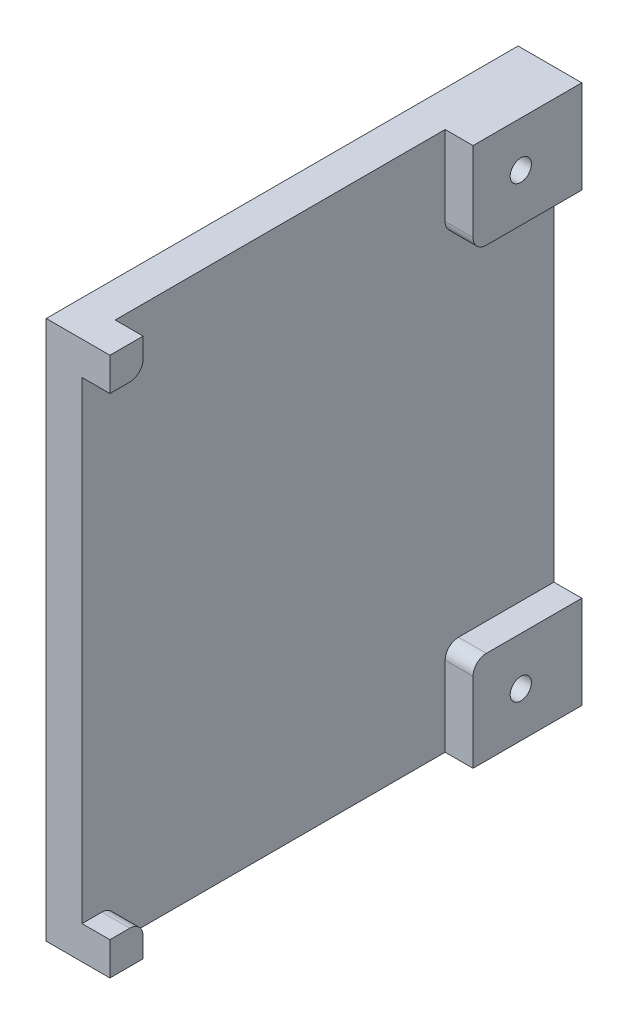
ISO-10303-21;
HEADER;
FILE_DESCRIPTION(('STEP AP214'),'2;1');
FILE_NAME('part.step','',(''),(''),'','','');
FILE_SCHEMA(('AUTOMOTIVE_DESIGN { 1 0 10303 214 1 1 1 1 }'));
ENDSEC;
DATA;
#1=APPLICATION_CONTEXT('core data for automotive mechanical design processes');
#2=APPLICATION_PROTOCOL_DEFINITION('international standard','automotive_design',2000,#1);
#3=PRODUCT_CONTEXT('',#1,'mechanical');
#4=PRODUCT('Part','Part','',(#3));
#5=PRODUCT_RELATED_PRODUCT_CATEGORY('part','',(#4));
#6=PRODUCT_DEFINITION_FORMATION('','',#4);
#7=PRODUCT_DEFINITION_CONTEXT('part definition',#1,'design');
#8=PRODUCT_DEFINITION('design','',#6,#7);
#9=PRODUCT_DEFINITION_SHAPE('','',#8);
#10=(LENGTH_UNIT() NAMED_UNIT(*) SI_UNIT(.MILLI.,.METRE.));
#11=(NAMED_UNIT(*) PLANE_ANGLE_UNIT() SI_UNIT($,.RADIAN.));
#12=(NAMED_UNIT(*) SI_UNIT($,.STERADIAN.) SOLID_ANGLE_UNIT());
#13=UNCERTAINTY_MEASURE_WITH_UNIT(LENGTH_MEASURE(1.E-05),#10,'distance_accuracy_value','');
#14=(GEOMETRIC_REPRESENTATION_CONTEXT(3) GLOBAL_UNCERTAINTY_ASSIGNED_CONTEXT((#13)) GLOBAL_UNIT_ASSIGNED_CONTEXT((#10,
#11,#12)) REPRESENTATION_CONTEXT('',''));
#15=CARTESIAN_POINT('',(0.,0.,0.));
#16=DIRECTION('',(0.,0.,1.));
#17=DIRECTION('',(1.,0.,0.));
#18=AXIS2_PLACEMENT_3D('',#15,#16,#17);
#19=CARTESIAN_POINT('',(3.,0.,0.));
#20=DIRECTION('',(1.,0.,0.));
#21=DIRECTION('',(0.,0.,-1.));
#22=AXIS2_PLACEMENT_3D('',#19,#20,#21);
#23=PLANE('',#22);
#24=DIRECTION('',(0.,1.,0.));
#25=VECTOR('',#24,1.);
#26=CARTESIAN_POINT('',(3.,0.,17.78));
#27=LINE('',#26,#25);
#28=CARTESIAN_POINT('',(3.,-17.82,17.78));
#29=VERTEX_POINT('',#28);
#30=CARTESIAN_POINT('',(3.,17.82,17.78));
#31=VERTEX_POINT('',#30);
#32=EDGE_CURVE('E297',#29,#31,#27,.T.);
#33=ORIENTED_EDGE('',*,*,#32,.F.);
#34=DIRECTION('',(0.,0.,-1.));
#35=VECTOR('',#34,1.);
#36=CARTESIAN_POINT('',(3.,-17.82,0.));
#37=LINE('',#36,#35);
#38=CARTESIAN_POINT('',(3.,-17.82,16.28));
#39=VERTEX_POINT('',#38);
#40=EDGE_CURVE('E269',#29,#39,#37,.T.);
#41=ORIENTED_EDGE('',*,*,#40,.T.);
#42=CARTESIAN_POINT('',(3.,-18.82,16.28));
#43=DIRECTION('',(1.,0.,0.));
#44=DIRECTION('',(0.,0.,-1.));
#45=AXIS2_PLACEMENT_3D('',#42,#43,#44);
#46=CIRCLE('',#45,1.);
#47=CARTESIAN_POINT('',(3.,-18.82,15.28));
#48=VERTEX_POINT('',#47);
#49=EDGE_CURVE('E349',#39,#48,#46,.F.);
#50=ORIENTED_EDGE('',*,*,#49,.T.);
#51=DIRECTION('',(0.,1.,0.));
#52=VECTOR('',#51,1.);
#53=CARTESIAN_POINT('',(3.,0.,15.28));
#54=LINE('',#53,#52);
#55=CARTESIAN_POINT('',(3.,-20.32,15.28));
#56=VERTEX_POINT('',#55);
#57=EDGE_CURVE('E256',#56,#48,#54,.T.);
#58=ORIENTED_EDGE('',*,*,#57,.F.);
#59=DIRECTION('',(0.,0.,-1.));
#60=VECTOR('',#59,1.);
#61=CARTESIAN_POINT('',(3.,-20.32,0.));
#62=LINE('',#61,#60);
#63=CARTESIAN_POINT('',(3.,-20.32,-9.5826));
#64=VERTEX_POINT('',#63);
#65=EDGE_CURVE('E303',#56,#64,#62,.T.);
#66=ORIENTED_EDGE('',*,*,#65,.T.);
#67=DIRECTION('',(0.,1.,0.));
#68=VECTOR('',#67,1.);
#69=CARTESIAN_POINT('',(3.,0.,-9.5826));
#70=LINE('',#69,#68);
#71=CARTESIAN_POINT('',(3.,-14.3164,-9.5826));
#72=VERTEX_POINT('',#71);
#73=EDGE_CURVE('E228',#64,#72,#70,.T.);
#74=ORIENTED_EDGE('',*,*,#73,.T.);
#75=CARTESIAN_POINT('',(3.,-14.3164,-10.5826));
#76=DIRECTION('',(1.,0.,0.));
#77=DIRECTION('',(0.,0.,-1.));
#78=AXIS2_PLACEMENT_3D('',#75,#76,#77);
#79=CIRCLE('',#78,1.);
#80=CARTESIAN_POINT('',(3.,-13.3164,-10.5826));
#81=VERTEX_POINT('',#80);
#82=EDGE_CURVE('E342',#72,#81,#79,.F.);
#83=ORIENTED_EDGE('',*,*,#82,.T.);
#84=DIRECTION('',(0.,0.,1.));
#85=VECTOR('',#84,1.);
#86=CARTESIAN_POINT('',(3.,-13.3164,0.));
#87=LINE('',#86,#85);
#88=CARTESIAN_POINT('',(3.,-13.3164,-17.78));
#89=VERTEX_POINT('',#88);
#90=EDGE_CURVE('E225',#89,#81,#87,.T.);
#91=ORIENTED_EDGE('',*,*,#90,.F.);
#92=DIRECTION('',(0.,1.,0.));
#93=VECTOR('',#92,1.);
#94=CARTESIAN_POINT('',(3.,0.,-17.78));
#95=LINE('',#94,#93);
#96=CARTESIAN_POINT('',(3.,13.3164,-17.78));
#97=VERTEX_POINT('',#96);
#98=EDGE_CURVE('E304',#89,#97,#95,.T.);
#99=ORIENTED_EDGE('',*,*,#98,.T.);
#100=DIRECTION('',(0.,0.,1.));
#101=VECTOR('',#100,1.);
#102=CARTESIAN_POINT('',(3.,13.3164,0.));
#103=LINE('',#102,#101);
#104=CARTESIAN_POINT('',(3.,13.3164,-10.5826));
#105=VERTEX_POINT('',#104);
#106=EDGE_CURVE('E217',#97,#105,#103,.T.);
#107=ORIENTED_EDGE('',*,*,#106,.T.);
#108=CARTESIAN_POINT('',(3.,14.3164,-10.5826));
#109=DIRECTION('',(1.,0.,0.));
#110=DIRECTION('',(0.,0.,-1.));
#111=AXIS2_PLACEMENT_3D('',#108,#109,#110);
#112=CIRCLE('',#111,1.);
#113=CARTESIAN_POINT('',(3.,14.3164,-9.5826));
#114=VERTEX_POINT('',#113);
#115=EDGE_CURVE('E341',#105,#114,#112,.F.);
#116=ORIENTED_EDGE('',*,*,#115,.T.);
#117=DIRECTION('',(0.,-1.,0.));
#118=VECTOR('',#117,1.);
#119=CARTESIAN_POINT('',(3.,0.,-9.5826));
#120=LINE('',#119,#118);
#121=CARTESIAN_POINT('',(3.,20.32,-9.5826));
#122=VERTEX_POINT('',#121);
#123=EDGE_CURVE('E253',#122,#114,#120,.T.);
#124=ORIENTED_EDGE('',*,*,#123,.F.);
#125=DIRECTION('',(0.,0.,-1.));
#126=VECTOR('',#125,1.);
#127=CARTESIAN_POINT('',(3.,20.32,0.));
#128=LINE('',#127,#126);
#129=CARTESIAN_POINT('',(3.,20.32,15.28));
#130=VERTEX_POINT('',#129);
#131=EDGE_CURVE('E222',#130,#122,#128,.T.);
#132=ORIENTED_EDGE('',*,*,#131,.F.);
#133=DIRECTION('',(0.,-1.,0.));
#134=VECTOR('',#133,1.);
#135=CARTESIAN_POINT('',(3.,0.,15.28));
#136=LINE('',#135,#134);
#137=CARTESIAN_POINT('',(3.,18.82,15.28));
#138=VERTEX_POINT('',#137);
#139=EDGE_CURVE('E244',#130,#138,#136,.T.);
#140=ORIENTED_EDGE('',*,*,#139,.T.);
#141=CARTESIAN_POINT('',(3.,18.82,16.28));
#142=DIRECTION('',(1.,0.,0.));
#143=DIRECTION('',(0.,0.,-1.));
#144=AXIS2_PLACEMENT_3D('',#141,#142,#143);
#145=CIRCLE('',#144,1.);
#146=CARTESIAN_POINT('',(3.,17.82,16.28));
#147=VERTEX_POINT('',#146);
#148=EDGE_CURVE('E350',#138,#147,#145,.F.);
#149=ORIENTED_EDGE('',*,*,#148,.T.);
#150=DIRECTION('',(0.,0.,-1.));
#151=VECTOR('',#150,1.);
#152=CARTESIAN_POINT('',(3.,17.82,0.));
#153=LINE('',#152,#151);
#154=EDGE_CURVE('E236',#31,#147,#153,.T.);
#155=ORIENTED_EDGE('',*,*,#154,.F.);
#156=EDGE_LOOP('',(#33,#41,#50,#58,#66,#74,#83,#91,#99,#107,#116,#124,#132,#140,#149,#155));
#157=FACE_BOUND('',#156,.T.);
#158=ADVANCED_FACE('F43',(#157),#23,.T.);
#159=CARTESIAN_POINT('',(3.,20.32,0.));
#160=DIRECTION('',(0.,1.,0.));
#161=DIRECTION('',(0.,0.,1.));
#162=AXIS2_PLACEMENT_3D('',#159,#160,#161);
#163=PLANE('',#162);
#164=DIRECTION('',(-1.,0.,0.));
#165=VECTOR('',#164,1.);
#166=CARTESIAN_POINT('',(3.,20.32,-17.78));
#167=LINE('',#166,#165);
#168=CARTESIAN_POINT('',(5.1,20.32,-17.78));
#169=VERTEX_POINT('',#168);
#170=CARTESIAN_POINT('',(0.300000000000002,20.32,-17.78));
#171=VERTEX_POINT('',#170);
#172=EDGE_CURVE('E310',#169,#171,#167,.T.);
#173=ORIENTED_EDGE('',*,*,#172,.T.);
#174=DIRECTION('',(0.,0.,1.));
#175=VECTOR('',#174,1.);
#176=CARTESIAN_POINT('',(0.300000000000002,20.32,17.78));
#177=LINE('',#176,#175);
#178=CARTESIAN_POINT('',(0.300000000000002,20.32,17.78));
#179=VERTEX_POINT('',#178);
#180=EDGE_CURVE('E371',#171,#179,#177,.T.);
#181=ORIENTED_EDGE('',*,*,#180,.T.);
#182=DIRECTION('',(-1.,0.,0.));
#183=VECTOR('',#182,1.);
#184=CARTESIAN_POINT('',(3.,20.32,17.78));
#185=LINE('',#184,#183);
#186=CARTESIAN_POINT('',(5.1,20.32,17.78));
#187=VERTEX_POINT('',#186);
#188=EDGE_CURVE('E312',#187,#179,#185,.T.);
#189=ORIENTED_EDGE('',*,*,#188,.F.);
#190=DIRECTION('',(0.,0.,1.));
#191=VECTOR('',#190,1.);
#192=CARTESIAN_POINT('',(5.1,20.32,0.));
#193=LINE('',#192,#191);
#194=CARTESIAN_POINT('',(5.1,20.32,15.28));
#195=VERTEX_POINT('',#194);
#196=EDGE_CURVE('E232',#195,#187,#193,.T.);
#197=ORIENTED_EDGE('',*,*,#196,.F.);
#198=DIRECTION('',(-1.,0.,0.));
#199=VECTOR('',#198,1.);
#200=CARTESIAN_POINT('',(5.1,20.32,15.28));
#201=LINE('',#200,#199);
#202=EDGE_CURVE('E254',#195,#130,#201,.T.);
#203=ORIENTED_EDGE('',*,*,#202,.T.);
#204=ORIENTED_EDGE('',*,*,#131,.T.);
#205=DIRECTION('',(-1.,0.,0.));
#206=VECTOR('',#205,1.);
#207=CARTESIAN_POINT('',(5.1,20.32,-9.5826));
#208=LINE('',#207,#206);
#209=CARTESIAN_POINT('',(5.1,20.32,-9.5826));
#210=VERTEX_POINT('',#209);
#211=EDGE_CURVE('E202',#210,#122,#208,.T.);
#212=ORIENTED_EDGE('',*,*,#211,.F.);
#213=DIRECTION('',(0.,0.,1.));
#214=VECTOR('',#213,1.);
#215=CARTESIAN_POINT('',(5.1,20.32,0.));
#216=LINE('',#215,#214);
#217=EDGE_CURVE('E210',#169,#210,#216,.T.);
#218=ORIENTED_EDGE('',*,*,#217,.F.);
#219=EDGE_LOOP('',(#173,#181,#189,#197,#203,#204,#212,#218));
#220=FACE_BOUND('',#219,.T.);
#221=ADVANCED_FACE('F219',(#220),#163,.T.);
#222=CARTESIAN_POINT('',(3.,0.,17.78));
#223=DIRECTION('',(0.,0.,1.));
#224=DIRECTION('',(1.,0.,0.));
#225=AXIS2_PLACEMENT_3D('',#222,#223,#224);
#226=PLANE('',#225);
#227=ORIENTED_EDGE('',*,*,#188,.T.);
#228=DIRECTION('',(0.,-1.,0.));
#229=VECTOR('',#228,1.);
#230=CARTESIAN_POINT('',(0.300000000000002,-20.32,17.78));
#231=LINE('',#230,#229);
#232=CARTESIAN_POINT('',(0.300000000000002,-20.32,17.78));
#233=VERTEX_POINT('',#232);
#234=EDGE_CURVE('E366',#179,#233,#231,.T.);
#235=ORIENTED_EDGE('',*,*,#234,.T.);
#236=DIRECTION('',(-1.,0.,0.));
#237=VECTOR('',#236,1.);
#238=CARTESIAN_POINT('',(3.,-20.32,17.78));
#239=LINE('',#238,#237);
#240=CARTESIAN_POINT('',(5.1,-20.32,17.78));
#241=VERTEX_POINT('',#240);
#242=EDGE_CURVE('E311',#241,#233,#239,.T.);
#243=ORIENTED_EDGE('',*,*,#242,.F.);
#244=DIRECTION('',(0.,-1.,0.));
#245=VECTOR('',#244,1.);
#246=CARTESIAN_POINT('',(5.1,0.,17.78));
#247=LINE('',#246,#245);
#248=CARTESIAN_POINT('',(5.1,-17.82,17.78));
#249=VERTEX_POINT('',#248);
#250=EDGE_CURVE('E260',#249,#241,#247,.T.);
#251=ORIENTED_EDGE('',*,*,#250,.F.);
#252=DIRECTION('',(-1.,0.,0.));
#253=VECTOR('',#252,1.);
#254=CARTESIAN_POINT('',(5.1,-17.82,17.78));
#255=LINE('',#254,#253);
#256=EDGE_CURVE('E247',#249,#29,#255,.T.);
#257=ORIENTED_EDGE('',*,*,#256,.T.);
#258=ORIENTED_EDGE('',*,*,#32,.T.);
#259=DIRECTION('',(-1.,0.,0.));
#260=VECTOR('',#259,1.);
#261=CARTESIAN_POINT('',(5.1,17.82,17.78));
#262=LINE('',#261,#260);
#263=CARTESIAN_POINT('',(5.1,17.82,17.78));
#264=VERTEX_POINT('',#263);
#265=EDGE_CURVE('E242',#264,#31,#262,.T.);
#266=ORIENTED_EDGE('',*,*,#265,.F.);
#267=DIRECTION('',(0.,-1.,0.));
#268=VECTOR('',#267,1.);
#269=CARTESIAN_POINT('',(5.1,0.,17.78));
#270=LINE('',#269,#268);
#271=EDGE_CURVE('E237',#187,#264,#270,.T.);
#272=ORIENTED_EDGE('',*,*,#271,.F.);
#273=EDGE_LOOP('',(#227,#235,#243,#251,#257,#258,#266,#272));
#274=FACE_BOUND('',#273,.T.);
#275=ADVANCED_FACE('F426',(#274),#226,.T.);
#276=CARTESIAN_POINT('',(3.,-20.32,0.));
#277=DIRECTION('',(0.,1.,0.));
#278=DIRECTION('',(0.,0.,1.));
#279=AXIS2_PLACEMENT_3D('',#276,#277,#278);
#280=PLANE('',#279);
#281=ORIENTED_EDGE('',*,*,#242,.T.);
#282=DIRECTION('',(0.,0.,-1.));
#283=VECTOR('',#282,1.);
#284=CARTESIAN_POINT('',(0.300000000000002,-20.32,0.));
#285=LINE('',#284,#283);
#286=CARTESIAN_POINT('',(0.300000000000002,-20.32,-17.78));
#287=VERTEX_POINT('',#286);
#288=EDGE_CURVE('E69',#233,#287,#285,.T.);
#289=ORIENTED_EDGE('',*,*,#288,.T.);
#290=DIRECTION('',(-1.,0.,0.));
#291=VECTOR('',#290,1.);
#292=CARTESIAN_POINT('',(3.,-20.32,-17.78));
#293=LINE('',#292,#291);
#294=CARTESIAN_POINT('',(5.1,-20.32,-17.78));
#295=VERTEX_POINT('',#294);
#296=EDGE_CURVE('E307',#295,#287,#293,.T.);
#297=ORIENTED_EDGE('',*,*,#296,.F.);
#298=DIRECTION('',(0.,0.,-1.));
#299=VECTOR('',#298,1.);
#300=CARTESIAN_POINT('',(5.1,-20.32,0.));
#301=LINE('',#300,#299);
#302=CARTESIAN_POINT('',(5.1,-20.32,-9.5826));
#303=VERTEX_POINT('',#302);
#304=EDGE_CURVE('E288',#303,#295,#301,.T.);
#305=ORIENTED_EDGE('',*,*,#304,.F.);
#306=DIRECTION('',(-1.,0.,0.));
#307=VECTOR('',#306,1.);
#308=CARTESIAN_POINT('',(5.1,-20.32,-9.5826));
#309=LINE('',#308,#307);
#310=EDGE_CURVE('E286',#303,#64,#309,.T.);
#311=ORIENTED_EDGE('',*,*,#310,.T.);
#312=ORIENTED_EDGE('',*,*,#65,.F.);
#313=DIRECTION('',(-1.,0.,0.));
#314=VECTOR('',#313,1.);
#315=CARTESIAN_POINT('',(5.1,-20.32,15.28));
#316=LINE('',#315,#314);
#317=CARTESIAN_POINT('',(5.1,-20.32,15.28));
#318=VERTEX_POINT('',#317);
#319=EDGE_CURVE('E268',#318,#56,#316,.T.);
#320=ORIENTED_EDGE('',*,*,#319,.F.);
#321=DIRECTION('',(0.,0.,-1.));
#322=VECTOR('',#321,1.);
#323=CARTESIAN_POINT('',(5.1,-20.32,0.));
#324=LINE('',#323,#322);
#325=EDGE_CURVE('E263',#241,#318,#324,.T.);
#326=ORIENTED_EDGE('',*,*,#325,.F.);
#327=EDGE_LOOP('',(#281,#289,#297,#305,#311,#312,#320,#326));
#328=FACE_BOUND('',#327,.T.);
#329=ADVANCED_FACE('F441',(#328),#280,.F.);
#330=CARTESIAN_POINT('',(3.,0.,-17.78));
#331=DIRECTION('',(0.,0.,1.));
#332=DIRECTION('',(1.,0.,0.));
#333=AXIS2_PLACEMENT_3D('',#330,#331,#332);
#334=PLANE('',#333);
#335=ORIENTED_EDGE('',*,*,#296,.T.);
#336=DIRECTION('',(0.,1.,0.));
#337=VECTOR('',#336,1.);
#338=CARTESIAN_POINT('',(0.300000000000002,0.,-17.78));
#339=LINE('',#338,#337);
#340=EDGE_CURVE('E63',#287,#171,#339,.T.);
#341=ORIENTED_EDGE('',*,*,#340,.T.);
#342=ORIENTED_EDGE('',*,*,#172,.F.);
#343=DIRECTION('',(0.,1.,0.));
#344=VECTOR('',#343,1.);
#345=CARTESIAN_POINT('',(5.1,0.,-17.78));
#346=LINE('',#345,#344);
#347=CARTESIAN_POINT('',(5.1,13.3164,-17.78));
#348=VERTEX_POINT('',#347);
#349=EDGE_CURVE('E215',#348,#169,#346,.T.);
#350=ORIENTED_EDGE('',*,*,#349,.F.);
#351=DIRECTION('',(-1.,0.,0.));
#352=VECTOR('',#351,1.);
#353=CARTESIAN_POINT('',(5.1,13.3164,-17.78));
#354=LINE('',#353,#352);
#355=EDGE_CURVE('E223',#348,#97,#354,.T.);
#356=ORIENTED_EDGE('',*,*,#355,.T.);
#357=ORIENTED_EDGE('',*,*,#98,.F.);
#358=DIRECTION('',(-1.,0.,0.));
#359=VECTOR('',#358,1.);
#360=CARTESIAN_POINT('',(5.1,-13.3164,-17.78));
#361=LINE('',#360,#359);
#362=CARTESIAN_POINT('',(5.1,-13.3164,-17.78));
#363=VERTEX_POINT('',#362);
#364=EDGE_CURVE('E298',#363,#89,#361,.T.);
#365=ORIENTED_EDGE('',*,*,#364,.F.);
#366=DIRECTION('',(0.,1.,0.));
#367=VECTOR('',#366,1.);
#368=CARTESIAN_POINT('',(5.1,0.,-17.78));
#369=LINE('',#368,#367);
#370=EDGE_CURVE('E280',#295,#363,#369,.T.);
#371=ORIENTED_EDGE('',*,*,#370,.F.);
#372=EDGE_LOOP('',(#335,#341,#342,#350,#356,#357,#365,#371));
#373=FACE_BOUND('',#372,.T.);
#374=ADVANCED_FACE('F440',(#373),#334,.F.);
#375=CARTESIAN_POINT('',(0.,0.,0.));
#376=DIRECTION('',(1.,0.,0.));
#377=DIRECTION('',(0.,0.,-1.));
#378=AXIS2_PLACEMENT_3D('',#375,#376,#377);
#379=PLANE('',#378);
#380=DIRECTION('',(0.,0.,1.));
#381=VECTOR('',#380,1.);
#382=CARTESIAN_POINT('',(0.,-20.02,0.));
#383=LINE('',#382,#381);
#384=CARTESIAN_POINT('',(0.,-20.02,-17.48));
#385=VERTEX_POINT('',#384);
#386=CARTESIAN_POINT('',(0.,-20.02,17.48));
#387=VERTEX_POINT('',#386);
#388=EDGE_CURVE('E363',#385,#387,#383,.T.);
#389=ORIENTED_EDGE('',*,*,#388,.T.);
#390=DIRECTION('',(0.,1.,0.));
#391=VECTOR('',#390,1.);
#392=CARTESIAN_POINT('',(0.,20.32,17.48));
#393=LINE('',#392,#391);
#394=CARTESIAN_POINT('',(0.,20.02,17.48));
#395=VERTEX_POINT('',#394);
#396=EDGE_CURVE('E361',#387,#395,#393,.T.);
#397=ORIENTED_EDGE('',*,*,#396,.T.);
#398=DIRECTION('',(0.,0.,-1.));
#399=VECTOR('',#398,1.);
#400=CARTESIAN_POINT('',(0.,20.02,-17.78));
#401=LINE('',#400,#399);
#402=CARTESIAN_POINT('',(0.,20.02,-17.48));
#403=VERTEX_POINT('',#402);
#404=EDGE_CURVE('E357',#395,#403,#401,.T.);
#405=ORIENTED_EDGE('',*,*,#404,.T.);
#406=DIRECTION('',(0.,-1.,0.));
#407=VECTOR('',#406,1.);
#408=CARTESIAN_POINT('',(0.,0.,-17.48));
#409=LINE('',#408,#407);
#410=EDGE_CURVE('E360',#403,#385,#409,.T.);
#411=ORIENTED_EDGE('',*,*,#410,.T.);
#412=EDGE_LOOP('',(#389,#397,#405,#411));
#413=FACE_BOUND('',#412,.T.);
#414=CARTESIAN_POINT('',(0.,16.9164,-13.1826));
#415=DIRECTION('',(1.,0.,0.));
#416=DIRECTION('',(0.,0.,-1.));
#417=AXIS2_PLACEMENT_3D('',#414,#415,#416);
#418=CIRCLE('',#417,1.1);
#419=CARTESIAN_POINT('',(0.,16.9164,-14.2826));
#420=VERTEX_POINT('',#419);
#421=EDGE_CURVE('E354',#420,#420,#418,.T.);
#422=ORIENTED_EDGE('',*,*,#421,.T.);
#423=EDGE_LOOP('',(#422));
#424=FACE_BOUND('',#423,.T.);
#425=CARTESIAN_POINT('',(0.,-16.9164,-13.1826));
#426=DIRECTION('',(1.,0.,0.));
#427=DIRECTION('',(0.,0.,-1.));
#428=AXIS2_PLACEMENT_3D('',#425,#426,#427);
#429=CIRCLE('',#428,1.1);
#430=CARTESIAN_POINT('',(0.,-16.9164,-14.2826));
#431=VERTEX_POINT('',#430);
#432=EDGE_CURVE('E352',#431,#431,#429,.T.);
#433=ORIENTED_EDGE('',*,*,#432,.T.);
#434=EDGE_LOOP('',(#433));
#435=FACE_BOUND('',#434,.T.);
#436=ADVANCED_FACE('F432',(#413,#424,#435),#379,.F.);
#437=CARTESIAN_POINT('',(5.1,-13.3164,0.));
#438=DIRECTION('',(0.,-1.,0.));
#439=DIRECTION('',(0.,0.,-1.));
#440=AXIS2_PLACEMENT_3D('',#437,#438,#439);
#441=PLANE('',#440);
#442=ORIENTED_EDGE('',*,*,#90,.T.);
#443=DIRECTION('',(-1.,0.,0.));
#444=VECTOR('',#443,1.);
#445=CARTESIAN_POINT('',(5.1,-13.3164,-10.5826));
#446=LINE('',#445,#444);
#447=CARTESIAN_POINT('',(5.1,-13.3164,-10.5826));
#448=VERTEX_POINT('',#447);
#449=EDGE_CURVE('E316',#81,#448,#446,.F.);
#450=ORIENTED_EDGE('',*,*,#449,.T.);
#451=DIRECTION('',(0.,0.,1.));
#452=VECTOR('',#451,1.);
#453=CARTESIAN_POINT('',(5.1,-13.3164,0.));
#454=LINE('',#453,#452);
#455=EDGE_CURVE('E285',#363,#448,#454,.T.);
#456=ORIENTED_EDGE('',*,*,#455,.F.);
#457=ORIENTED_EDGE('',*,*,#364,.T.);
#458=EDGE_LOOP('',(#442,#450,#456,#457));
#459=FACE_BOUND('',#458,.T.);
#460=ADVANCED_FACE('F435',(#459),#441,.F.);
#461=CARTESIAN_POINT('',(5.1,0.,-9.5826));
#462=DIRECTION('',(0.,0.,1.));
#463=DIRECTION('',(0.,-1.,0.));
#464=AXIS2_PLACEMENT_3D('',#461,#462,#463);
#465=PLANE('',#464);
#466=DIRECTION('',(0.,1.,0.));
#467=VECTOR('',#466,1.);
#468=CARTESIAN_POINT('',(5.1,0.,-9.5826));
#469=LINE('',#468,#467);
#470=CARTESIAN_POINT('',(5.1,-14.3164,-9.5826));
#471=VERTEX_POINT('',#470);
#472=EDGE_CURVE('E281',#303,#471,#469,.T.);
#473=ORIENTED_EDGE('',*,*,#472,.T.);
#474=DIRECTION('',(-1.,0.,0.));
#475=VECTOR('',#474,1.);
#476=CARTESIAN_POINT('',(3.,-14.3164,-9.5826));
#477=LINE('',#476,#475);
#478=EDGE_CURVE('E317',#471,#72,#477,.T.);
#479=ORIENTED_EDGE('',*,*,#478,.T.);
#480=ORIENTED_EDGE('',*,*,#73,.F.);
#481=ORIENTED_EDGE('',*,*,#310,.F.);
#482=EDGE_LOOP('',(#473,#479,#480,#481));
#483=FACE_BOUND('',#482,.T.);
#484=ADVANCED_FACE('F536',(#483),#465,.T.);
#485=CARTESIAN_POINT('',(5.1,0.,0.));
#486=DIRECTION('',(1.,0.,0.));
#487=DIRECTION('',(0.,0.,-1.));
#488=AXIS2_PLACEMENT_3D('',#485,#486,#487);
#489=PLANE('',#488);
#490=CARTESIAN_POINT('',(5.1,-16.9164,-13.1826));
#491=DIRECTION('',(1.,0.,0.));
#492=DIRECTION('',(0.,0.,-1.));
#493=AXIS2_PLACEMENT_3D('',#490,#491,#492);
#494=CIRCLE('',#493,0.799999999999999);
#495=CARTESIAN_POINT('',(5.1,-16.9164,-13.9826));
#496=VERTEX_POINT('',#495);
#497=EDGE_CURVE('E275',#496,#496,#494,.T.);
#498=ORIENTED_EDGE('',*,*,#497,.F.);
#499=EDGE_LOOP('',(#498));
#500=FACE_BOUND('',#499,.T.);
#501=ORIENTED_EDGE('',*,*,#455,.T.);
#502=CARTESIAN_POINT('',(5.1,-14.3164,-10.5826));
#503=DIRECTION('',(1.,0.,0.));
#504=DIRECTION('',(0.,0.,-1.));
#505=AXIS2_PLACEMENT_3D('',#502,#503,#504);
#506=CIRCLE('',#505,1.);
#507=EDGE_CURVE('E323',#448,#471,#506,.T.);
#508=ORIENTED_EDGE('',*,*,#507,.T.);
#509=ORIENTED_EDGE('',*,*,#472,.F.);
#510=ORIENTED_EDGE('',*,*,#304,.T.);
#511=ORIENTED_EDGE('',*,*,#370,.T.);
#512=EDGE_LOOP('',(#501,#508,#509,#510,#511));
#513=FACE_BOUND('',#512,.T.);
#514=ADVANCED_FACE('F516',(#500,#513),#489,.T.);
#515=CARTESIAN_POINT('',(5.1,0.,-9.5826));
#516=DIRECTION('',(0.,0.,-1.));
#517=DIRECTION('',(0.,1.,0.));
#518=AXIS2_PLACEMENT_3D('',#515,#516,#517);
#519=PLANE('',#518);
#520=ORIENTED_EDGE('',*,*,#123,.T.);
#521=DIRECTION('',(-1.,0.,0.));
#522=VECTOR('',#521,1.);
#523=CARTESIAN_POINT('',(5.1,14.3164,-9.5826));
#524=LINE('',#523,#522);
#525=CARTESIAN_POINT('',(5.1,14.3164,-9.5826));
#526=VERTEX_POINT('',#525);
#527=EDGE_CURVE('E203',#114,#526,#524,.F.);
#528=ORIENTED_EDGE('',*,*,#527,.T.);
#529=DIRECTION('',(0.,-1.,0.));
#530=VECTOR('',#529,1.);
#531=CARTESIAN_POINT('',(5.1,0.,-9.5826));
#532=LINE('',#531,#530);
#533=EDGE_CURVE('E197',#210,#526,#532,.T.);
#534=ORIENTED_EDGE('',*,*,#533,.F.);
#535=ORIENTED_EDGE('',*,*,#211,.T.);
#536=EDGE_LOOP('',(#520,#528,#534,#535));
#537=FACE_BOUND('',#536,.T.);
#538=ADVANCED_FACE('F199',(#537),#519,.F.);
#539=CARTESIAN_POINT('',(5.1,13.3164,0.));
#540=DIRECTION('',(0.,-1.,0.));
#541=DIRECTION('',(0.,0.,-1.));
#542=AXIS2_PLACEMENT_3D('',#539,#540,#541);
#543=PLANE('',#542);
#544=DIRECTION('',(0.,0.,1.));
#545=VECTOR('',#544,1.);
#546=CARTESIAN_POINT('',(5.1,13.3164,0.));
#547=LINE('',#546,#545);
#548=CARTESIAN_POINT('',(5.1,13.3164,-10.5826));
#549=VERTEX_POINT('',#548);
#550=EDGE_CURVE('E207',#348,#549,#547,.T.);
#551=ORIENTED_EDGE('',*,*,#550,.T.);
#552=DIRECTION('',(-1.,0.,0.));
#553=VECTOR('',#552,1.);
#554=CARTESIAN_POINT('',(3.,13.3164,-10.5826));
#555=LINE('',#554,#553);
#556=EDGE_CURVE('E322',#549,#105,#555,.T.);
#557=ORIENTED_EDGE('',*,*,#556,.T.);
#558=ORIENTED_EDGE('',*,*,#106,.F.);
#559=ORIENTED_EDGE('',*,*,#355,.F.);
#560=EDGE_LOOP('',(#551,#557,#558,#559));
#561=FACE_BOUND('',#560,.T.);
#562=ADVANCED_FACE('F404',(#561),#543,.T.);
#563=CARTESIAN_POINT('',(5.1,0.,0.));
#564=DIRECTION('',(1.,0.,0.));
#565=DIRECTION('',(0.,0.,-1.));
#566=AXIS2_PLACEMENT_3D('',#563,#564,#565);
#567=PLANE('',#566);
#568=CARTESIAN_POINT('',(5.1,16.9164,-13.1826));
#569=DIRECTION('',(1.,0.,0.));
#570=DIRECTION('',(0.,0.,-1.));
#571=AXIS2_PLACEMENT_3D('',#568,#569,#570);
#572=CIRCLE('',#571,0.799999999999999);
#573=CARTESIAN_POINT('',(5.1,16.9164,-13.9826));
#574=VERTEX_POINT('',#573);
#575=EDGE_CURVE('E383',#574,#574,#572,.T.);
#576=ORIENTED_EDGE('',*,*,#575,.F.);
#577=EDGE_LOOP('',(#576));
#578=FACE_BOUND('',#577,.T.);
#579=ORIENTED_EDGE('',*,*,#533,.T.);
#580=CARTESIAN_POINT('',(5.1,14.3164,-10.5826));
#581=DIRECTION('',(1.,0.,0.));
#582=DIRECTION('',(0.,0.,-1.));
#583=AXIS2_PLACEMENT_3D('',#580,#581,#582);
#584=CIRCLE('',#583,1.);
#585=EDGE_CURVE('E330',#526,#549,#584,.T.);
#586=ORIENTED_EDGE('',*,*,#585,.T.);
#587=ORIENTED_EDGE('',*,*,#550,.F.);
#588=ORIENTED_EDGE('',*,*,#349,.T.);
#589=ORIENTED_EDGE('',*,*,#217,.T.);
#590=EDGE_LOOP('',(#579,#586,#587,#588,#589));
#591=FACE_BOUND('',#590,.T.);
#592=ADVANCED_FACE('F213',(#578,#591),#567,.T.);
#593=CARTESIAN_POINT('',(5.1,0.,15.28));
#594=DIRECTION('',(0.,0.,-1.));
#595=DIRECTION('',(-1.,0.,0.));
#596=AXIS2_PLACEMENT_3D('',#593,#594,#595);
#597=PLANE('',#596);
#598=DIRECTION('',(0.,-1.,0.));
#599=VECTOR('',#598,1.);
#600=CARTESIAN_POINT('',(5.1,0.,15.28));
#601=LINE('',#600,#599);
#602=CARTESIAN_POINT('',(5.1,18.82,15.28));
#603=VERTEX_POINT('',#602);
#604=EDGE_CURVE('E235',#195,#603,#601,.T.);
#605=ORIENTED_EDGE('',*,*,#604,.T.);
#606=DIRECTION('',(-1.,0.,0.));
#607=VECTOR('',#606,1.);
#608=CARTESIAN_POINT('',(3.,18.82,15.28));
#609=LINE('',#608,#607);
#610=EDGE_CURVE('E329',#603,#138,#609,.T.);
#611=ORIENTED_EDGE('',*,*,#610,.T.);
#612=ORIENTED_EDGE('',*,*,#139,.F.);
#613=ORIENTED_EDGE('',*,*,#202,.F.);
#614=EDGE_LOOP('',(#605,#611,#612,#613));
#615=FACE_BOUND('',#614,.T.);
#616=ADVANCED_FACE('F511',(#615),#597,.T.);
#617=CARTESIAN_POINT('',(5.1,17.82,0.));
#618=DIRECTION('',(0.,1.,0.));
#619=DIRECTION('',(0.,0.,1.));
#620=AXIS2_PLACEMENT_3D('',#617,#618,#619);
#621=PLANE('',#620);
#622=ORIENTED_EDGE('',*,*,#154,.T.);
#623=DIRECTION('',(-1.,0.,0.));
#624=VECTOR('',#623,1.);
#625=CARTESIAN_POINT('',(5.1,17.82,16.28));
#626=LINE('',#625,#624);
#627=CARTESIAN_POINT('',(5.1,17.82,16.28));
#628=VERTEX_POINT('',#627);
#629=EDGE_CURVE('E335',#147,#628,#626,.F.);
#630=ORIENTED_EDGE('',*,*,#629,.T.);
#631=DIRECTION('',(0.,0.,-1.));
#632=VECTOR('',#631,1.);
#633=CARTESIAN_POINT('',(5.1,17.82,0.));
#634=LINE('',#633,#632);
#635=EDGE_CURVE('E241',#264,#628,#634,.T.);
#636=ORIENTED_EDGE('',*,*,#635,.F.);
#637=ORIENTED_EDGE('',*,*,#265,.T.);
#638=EDGE_LOOP('',(#622,#630,#636,#637));
#639=FACE_BOUND('',#638,.T.);
#640=ADVANCED_FACE('F521',(#639),#621,.F.);
#641=CARTESIAN_POINT('',(5.1,0.,0.));
#642=DIRECTION('',(1.,0.,0.));
#643=DIRECTION('',(0.,0.,-1.));
#644=AXIS2_PLACEMENT_3D('',#641,#642,#643);
#645=PLANE('',#644);
#646=ORIENTED_EDGE('',*,*,#635,.T.);
#647=CARTESIAN_POINT('',(5.1,18.82,16.28));
#648=DIRECTION('',(1.,0.,0.));
#649=DIRECTION('',(0.,0.,-1.));
#650=AXIS2_PLACEMENT_3D('',#647,#648,#649);
#651=CIRCLE('',#650,1.);
#652=EDGE_CURVE('E334',#628,#603,#651,.T.);
#653=ORIENTED_EDGE('',*,*,#652,.T.);
#654=ORIENTED_EDGE('',*,*,#604,.F.);
#655=ORIENTED_EDGE('',*,*,#196,.T.);
#656=ORIENTED_EDGE('',*,*,#271,.T.);
#657=EDGE_LOOP('',(#646,#653,#654,#655,#656));
#658=FACE_BOUND('',#657,.T.);
#659=ADVANCED_FACE('F522',(#658),#645,.T.);
#660=CARTESIAN_POINT('',(5.1,-17.82,0.));
#661=DIRECTION('',(0.,1.,0.));
#662=DIRECTION('',(0.,0.,1.));
#663=AXIS2_PLACEMENT_3D('',#660,#661,#662);
#664=PLANE('',#663);
#665=DIRECTION('',(0.,0.,-1.));
#666=VECTOR('',#665,1.);
#667=CARTESIAN_POINT('',(5.1,-17.82,0.));
#668=LINE('',#667,#666);
#669=CARTESIAN_POINT('',(5.1,-17.82,16.28));
#670=VERTEX_POINT('',#669);
#671=EDGE_CURVE('E258',#249,#670,#668,.T.);
#672=ORIENTED_EDGE('',*,*,#671,.T.);
#673=DIRECTION('',(-1.,0.,0.));
#674=VECTOR('',#673,1.);
#675=CARTESIAN_POINT('',(3.,-17.82,16.28));
#676=LINE('',#675,#674);
#677=EDGE_CURVE('E337',#670,#39,#676,.T.);
#678=ORIENTED_EDGE('',*,*,#677,.T.);
#679=ORIENTED_EDGE('',*,*,#40,.F.);
#680=ORIENTED_EDGE('',*,*,#256,.F.);
#681=EDGE_LOOP('',(#672,#678,#679,#680));
#682=FACE_BOUND('',#681,.T.);
#683=ADVANCED_FACE('F524',(#682),#664,.T.);
#684=CARTESIAN_POINT('',(5.1,0.,15.28));
#685=DIRECTION('',(0.,0.,1.));
#686=DIRECTION('',(1.,0.,0.));
#687=AXIS2_PLACEMENT_3D('',#684,#685,#686);
#688=PLANE('',#687);
#689=ORIENTED_EDGE('',*,*,#57,.T.);
#690=DIRECTION('',(-1.,0.,0.));
#691=VECTOR('',#690,1.);
#692=CARTESIAN_POINT('',(5.1,-18.82,15.28));
#693=LINE('',#692,#691);
#694=CARTESIAN_POINT('',(5.1,-18.82,15.28));
#695=VERTEX_POINT('',#694);
#696=EDGE_CURVE('E339',#48,#695,#693,.F.);
#697=ORIENTED_EDGE('',*,*,#696,.T.);
#698=DIRECTION('',(0.,1.,0.));
#699=VECTOR('',#698,1.);
#700=CARTESIAN_POINT('',(5.1,0.,15.28));
#701=LINE('',#700,#699);
#702=EDGE_CURVE('E261',#318,#695,#701,.T.);
#703=ORIENTED_EDGE('',*,*,#702,.F.);
#704=ORIENTED_EDGE('',*,*,#319,.T.);
#705=EDGE_LOOP('',(#689,#697,#703,#704));
#706=FACE_BOUND('',#705,.T.);
#707=ADVANCED_FACE('F507',(#706),#688,.F.);
#708=CARTESIAN_POINT('',(5.1,0.,0.));
#709=DIRECTION('',(1.,0.,0.));
#710=DIRECTION('',(0.,0.,-1.));
#711=AXIS2_PLACEMENT_3D('',#708,#709,#710);
#712=PLANE('',#711);
#713=ORIENTED_EDGE('',*,*,#702,.T.);
#714=CARTESIAN_POINT('',(5.1,-18.82,16.28));
#715=DIRECTION('',(1.,0.,0.));
#716=DIRECTION('',(0.,0.,-1.));
#717=AXIS2_PLACEMENT_3D('',#714,#715,#716);
#718=CIRCLE('',#717,1.);
#719=EDGE_CURVE('E343',#695,#670,#718,.T.);
#720=ORIENTED_EDGE('',*,*,#719,.T.);
#721=ORIENTED_EDGE('',*,*,#671,.F.);
#722=ORIENTED_EDGE('',*,*,#250,.T.);
#723=ORIENTED_EDGE('',*,*,#325,.T.);
#724=EDGE_LOOP('',(#713,#720,#721,#722,#723));
#725=FACE_BOUND('',#724,.T.);
#726=ADVANCED_FACE('F499',(#725),#712,.T.);
#727=CARTESIAN_POINT('',(0.,16.9164,-13.1826));
#728=DIRECTION('',(1.,0.,0.));
#729=DIRECTION('',(0.,0.,-1.));
#730=AXIS2_PLACEMENT_3D('',#727,#728,#729);
#731=CYLINDRICAL_SURFACE('',#730,0.799999999999999);
#732=CARTESIAN_POINT('',(0.300000000000005,16.9164,-13.1826));
#733=DIRECTION('',(1.,0.,0.));
#734=DIRECTION('',(0.,0.,-1.));
#735=AXIS2_PLACEMENT_3D('',#732,#733,#734);
#736=CIRCLE('',#735,0.799999999999999);
#737=CARTESIAN_POINT('',(0.300000000000005,16.9164,-13.9826));
#738=VERTEX_POINT('',#737);
#739=EDGE_CURVE('E52',#738,#738,#736,.F.);
#740=ORIENTED_EDGE('',*,*,#739,.T.);
#741=EDGE_LOOP('',(#740));
#742=FACE_BOUND('',#741,.T.);
#743=ORIENTED_EDGE('',*,*,#575,.T.);
#744=EDGE_LOOP('',(#743));
#745=FACE_BOUND('',#744,.T.);
#746=ADVANCED_FACE('F498',(#742,#745),#731,.F.);
#747=CARTESIAN_POINT('',(0.,-16.9164,-13.1826));
#748=DIRECTION('',(1.,0.,0.));
#749=DIRECTION('',(0.,0.,-1.));
#750=AXIS2_PLACEMENT_3D('',#747,#748,#749);
#751=CYLINDRICAL_SURFACE('',#750,0.799999999999999);
#752=CARTESIAN_POINT('',(0.300000000000005,-16.9164,-13.1826));
#753=DIRECTION('',(1.,0.,0.));
#754=DIRECTION('',(0.,0.,-1.));
#755=AXIS2_PLACEMENT_3D('',#752,#753,#754);
#756=CIRCLE('',#755,0.799999999999999);
#757=CARTESIAN_POINT('',(0.300000000000005,-16.9164,-13.9826));
#758=VERTEX_POINT('',#757);
#759=EDGE_CURVE('E11',#758,#758,#756,.F.);
#760=ORIENTED_EDGE('',*,*,#759,.T.);
#761=EDGE_LOOP('',(#760));
#762=FACE_BOUND('',#761,.T.);
#763=ORIENTED_EDGE('',*,*,#497,.T.);
#764=EDGE_LOOP('',(#763));
#765=FACE_BOUND('',#764,.T.);
#766=ADVANCED_FACE('F419',(#762,#765),#751,.F.);
#767=CARTESIAN_POINT('',(5.1,-14.3164,-10.5826));
#768=DIRECTION('',(1.,0.,0.));
#769=DIRECTION('',(0.,0.,-1.));
#770=AXIS2_PLACEMENT_3D('',#767,#768,#769);
#771=CYLINDRICAL_SURFACE('',#770,1.);
#772=ORIENTED_EDGE('',*,*,#507,.F.);
#773=ORIENTED_EDGE('',*,*,#449,.F.);
#774=ORIENTED_EDGE('',*,*,#82,.F.);
#775=ORIENTED_EDGE('',*,*,#478,.F.);
#776=EDGE_LOOP('',(#772,#773,#774,#775));
#777=FACE_BOUND('',#776,.T.);
#778=ADVANCED_FACE('F406',(#777),#771,.T.);
#779=CARTESIAN_POINT('',(5.1,14.3164,-10.5826));
#780=DIRECTION('',(1.,0.,0.));
#781=DIRECTION('',(0.,0.,-1.));
#782=AXIS2_PLACEMENT_3D('',#779,#780,#781);
#783=CYLINDRICAL_SURFACE('',#782,1.);
#784=ORIENTED_EDGE('',*,*,#585,.F.);
#785=ORIENTED_EDGE('',*,*,#527,.F.);
#786=ORIENTED_EDGE('',*,*,#115,.F.);
#787=ORIENTED_EDGE('',*,*,#556,.F.);
#788=EDGE_LOOP('',(#784,#785,#786,#787));
#789=FACE_BOUND('',#788,.T.);
#790=ADVANCED_FACE('F409',(#789),#783,.T.);
#791=CARTESIAN_POINT('',(5.1,18.82,16.28));
#792=DIRECTION('',(1.,0.,0.));
#793=DIRECTION('',(0.,0.,-1.));
#794=AXIS2_PLACEMENT_3D('',#791,#792,#793);
#795=CYLINDRICAL_SURFACE('',#794,1.);
#796=ORIENTED_EDGE('',*,*,#652,.F.);
#797=ORIENTED_EDGE('',*,*,#629,.F.);
#798=ORIENTED_EDGE('',*,*,#148,.F.);
#799=ORIENTED_EDGE('',*,*,#610,.F.);
#800=EDGE_LOOP('',(#796,#797,#798,#799));
#801=FACE_BOUND('',#800,.T.);
#802=ADVANCED_FACE('F410',(#801),#795,.T.);
#803=CARTESIAN_POINT('',(5.1,-18.82,16.28));
#804=DIRECTION('',(1.,0.,0.));
#805=DIRECTION('',(0.,0.,-1.));
#806=AXIS2_PLACEMENT_3D('',#803,#804,#805);
#807=CYLINDRICAL_SURFACE('',#806,1.);
#808=ORIENTED_EDGE('',*,*,#719,.F.);
#809=ORIENTED_EDGE('',*,*,#696,.F.);
#810=ORIENTED_EDGE('',*,*,#49,.F.);
#811=ORIENTED_EDGE('',*,*,#677,.F.);
#812=EDGE_LOOP('',(#808,#809,#810,#811));
#813=FACE_BOUND('',#812,.T.);
#814=ADVANCED_FACE('F417',(#813),#807,.T.);
#815=CARTESIAN_POINT('',(0.300000000000002,0.,-17.78));
#816=DIRECTION('',(0.707106781186548,0.,0.707106781186548));
#817=DIRECTION('',(0.,1.,0.));
#818=AXIS2_PLACEMENT_3D('',#815,#816,#817);
#819=PLANE('',#818);
#820=DIRECTION('',(0.577350269189626,0.577350269189626,-0.577350269189626));
#821=VECTOR('',#820,1.);
#822=CARTESIAN_POINT('',(-5.82666666666667,14.1933333333333,-11.6533333333333));
#823=LINE('',#822,#821);
#824=EDGE_CURVE('E377',#171,#403,#823,.F.);
#825=ORIENTED_EDGE('',*,*,#824,.F.);
#826=ORIENTED_EDGE('',*,*,#340,.F.);
#827=DIRECTION('',(-0.577350269189626,0.577350269189626,0.577350269189626));
#828=VECTOR('',#827,1.);
#829=CARTESIAN_POINT('',(-6.47333333333333,-13.5466666666667,-11.0066666666667));
#830=LINE('',#829,#828);
#831=EDGE_CURVE('E48',#385,#287,#830,.F.);
#832=ORIENTED_EDGE('',*,*,#831,.F.);
#833=ORIENTED_EDGE('',*,*,#410,.F.);
#834=EDGE_LOOP('',(#825,#826,#832,#833));
#835=FACE_BOUND('',#834,.T.);
#836=ADVANCED_FACE('F465',(#835),#819,.F.);
#837=CARTESIAN_POINT('',(0.300000000000002,-20.32,0.));
#838=DIRECTION('',(0.707106781186548,0.707106781186548,0.));
#839=DIRECTION('',(0.,0.,-1.));
#840=AXIS2_PLACEMENT_3D('',#837,#838,#839);
#841=PLANE('',#840);
#842=ORIENTED_EDGE('',*,*,#831,.T.);
#843=ORIENTED_EDGE('',*,*,#288,.F.);
#844=DIRECTION('',(0.577350269189626,-0.577350269189626,0.577350269189626));
#845=VECTOR('',#844,1.);
#846=CARTESIAN_POINT('',(-5.62666666666667,-14.3933333333333,11.8533333333333));
#847=LINE('',#846,#845);
#848=EDGE_CURVE('E380',#387,#233,#847,.T.);
#849=ORIENTED_EDGE('',*,*,#848,.F.);
#850=ORIENTED_EDGE('',*,*,#388,.F.);
#851=EDGE_LOOP('',(#842,#843,#849,#850));
#852=FACE_BOUND('',#851,.T.);
#853=ADVANCED_FACE('F456',(#852),#841,.F.);
#854=CARTESIAN_POINT('',(0.,20.02,0.));
#855=DIRECTION('',(-0.707106781186548,0.707106781186548,0.));
#856=DIRECTION('',(0.,0.,1.));
#857=AXIS2_PLACEMENT_3D('',#854,#855,#856);
#858=PLANE('',#857);
#859=ORIENTED_EDGE('',*,*,#824,.T.);
#860=ORIENTED_EDGE('',*,*,#404,.F.);
#861=DIRECTION('',(0.577350269189626,0.577350269189626,0.577350269189626));
#862=VECTOR('',#861,1.);
#863=CARTESIAN_POINT('',(-5.82666666666666,14.1933333333333,11.6533333333333));
#864=LINE('',#863,#862);
#865=EDGE_CURVE('E374',#179,#395,#864,.F.);
#866=ORIENTED_EDGE('',*,*,#865,.F.);
#867=ORIENTED_EDGE('',*,*,#180,.F.);
#868=EDGE_LOOP('',(#859,#860,#866,#867));
#869=FACE_BOUND('',#868,.T.);
#870=ADVANCED_FACE('F460',(#869),#858,.T.);
#871=CARTESIAN_POINT('',(0.,0.,17.48));
#872=DIRECTION('',(-0.707106781186548,0.,0.707106781186548));
#873=DIRECTION('',(0.,-1.,0.));
#874=AXIS2_PLACEMENT_3D('',#871,#872,#873);
#875=PLANE('',#874);
#876=ORIENTED_EDGE('',*,*,#848,.T.);
#877=ORIENTED_EDGE('',*,*,#234,.F.);
#878=ORIENTED_EDGE('',*,*,#865,.T.);
#879=ORIENTED_EDGE('',*,*,#396,.F.);
#880=EDGE_LOOP('',(#876,#877,#878,#879));
#881=FACE_BOUND('',#880,.T.);
#882=ADVANCED_FACE('F455',(#881),#875,.T.);
#883=CARTESIAN_POINT('',(0.,16.9164,-13.1826));
#884=DIRECTION('',(-1.,0.,0.));
#885=DIRECTION('',(0.,0.,1.));
#886=AXIS2_PLACEMENT_3D('',#883,#884,#885);
#887=CONICAL_SURFACE('',#886,1.1,0.785398163397448);
#888=ORIENTED_EDGE('',*,*,#739,.F.);
#889=EDGE_LOOP('',(#888));
#890=FACE_BOUND('',#889,.T.);
#891=ORIENTED_EDGE('',*,*,#421,.F.);
#892=EDGE_LOOP('',(#891));
#893=FACE_BOUND('',#892,.T.);
#894=ADVANCED_FACE('F476',(#890,#893),#887,.F.);
#895=CARTESIAN_POINT('',(0.,-16.9164,-13.1826));
#896=DIRECTION('',(-1.,0.,0.));
#897=DIRECTION('',(0.,0.,1.));
#898=AXIS2_PLACEMENT_3D('',#895,#896,#897);
#899=CONICAL_SURFACE('',#898,1.1,0.785398163397448);
#900=ORIENTED_EDGE('',*,*,#759,.F.);
#901=EDGE_LOOP('',(#900));
#902=FACE_BOUND('',#901,.T.);
#903=ORIENTED_EDGE('',*,*,#432,.F.);
#904=EDGE_LOOP('',(#903));
#905=FACE_BOUND('',#904,.T.);
#906=ADVANCED_FACE('F46',(#902,#905),#899,.F.);
#907=CLOSED_SHELL('',(#158,#221,#275,#329,#374,#436,#460,#484,#514,#538,#562,#592,#616,#640,
#659,#683,#707,#726,#746,#766,#778,#790,#802,#814,#836,#853,#870,#882,#894,#906));
#908=MANIFOLD_SOLID_BREP('B2',#907);
#909=ADVANCED_BREP_SHAPE_REPRESENTATION('',(#18,#908),#14);
#910=SHAPE_DEFINITION_REPRESENTATION(#9,#909);
ENDSEC;
END-ISO-10303-21;
